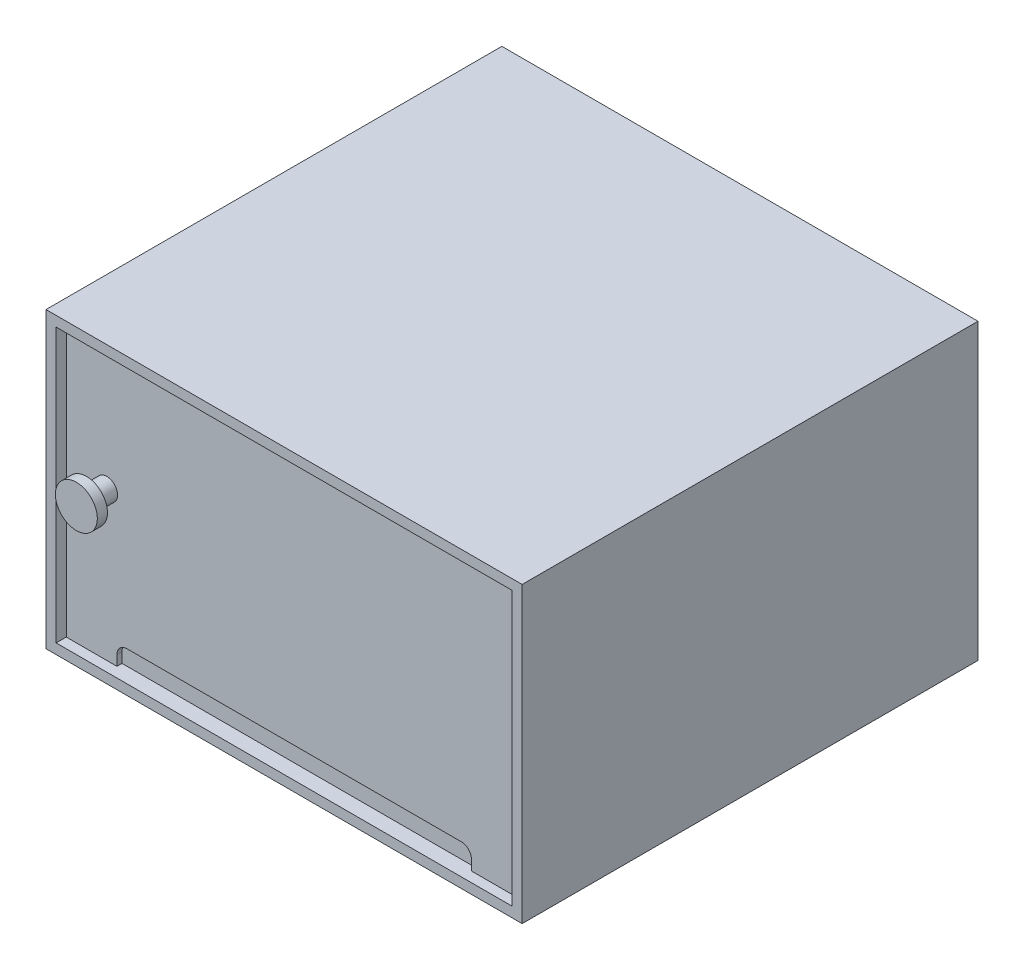
ISO-10303-21;
HEADER;
FILE_DESCRIPTION(('STEP AP214'),'2;1');
FILE_NAME('part.step','',(''),(''),'','','');
FILE_SCHEMA(('AUTOMOTIVE_DESIGN { 1 0 10303 214 1 1 1 1 }'));
ENDSEC;
DATA;
#1=APPLICATION_CONTEXT('core data for automotive mechanical design processes');
#2=APPLICATION_PROTOCOL_DEFINITION('international standard','automotive_design',2000,#1);
#3=PRODUCT_CONTEXT('',#1,'mechanical');
#4=PRODUCT('Part','Part','',(#3));
#5=PRODUCT_RELATED_PRODUCT_CATEGORY('part','',(#4));
#6=PRODUCT_DEFINITION_FORMATION('','',#4);
#7=PRODUCT_DEFINITION_CONTEXT('part definition',#1,'design');
#8=PRODUCT_DEFINITION('design','',#6,#7);
#9=PRODUCT_DEFINITION_SHAPE('','',#8);
#10=(LENGTH_UNIT() NAMED_UNIT(*) SI_UNIT(.MILLI.,.METRE.));
#11=(NAMED_UNIT(*) PLANE_ANGLE_UNIT() SI_UNIT($,.RADIAN.));
#12=(NAMED_UNIT(*) SI_UNIT($,.STERADIAN.) SOLID_ANGLE_UNIT());
#13=UNCERTAINTY_MEASURE_WITH_UNIT(LENGTH_MEASURE(1.E-05),#10,'distance_accuracy_value','');
#14=(GEOMETRIC_REPRESENTATION_CONTEXT(3) GLOBAL_UNCERTAINTY_ASSIGNED_CONTEXT((#13)) GLOBAL_UNIT_ASSIGNED_CONTEXT((#10,
#11,#12)) REPRESENTATION_CONTEXT('',''));
#15=CARTESIAN_POINT('',(0.,0.,0.));
#16=DIRECTION('',(0.,0.,1.));
#17=DIRECTION('',(1.,0.,0.));
#18=AXIS2_PLACEMENT_3D('',#15,#16,#17);
#19=CARTESIAN_POINT('',(-185.027804201985,156.673678498549,245.));
#20=DIRECTION('',(0.,0.,-1.));
#21=DIRECTION('',(-1.,0.,0.));
#22=AXIS2_PLACEMENT_3D('',#19,#20,#21);
#23=CYLINDRICAL_SURFACE('',#22,20.687155437454);
#24=CARTESIAN_POINT('',(-185.027804201985,156.673678498549,245.));
#25=DIRECTION('',(0.,0.,1.));
#26=DIRECTION('',(1.,0.,0.));
#27=AXIS2_PLACEMENT_3D('',#24,#25,#26);
#28=CIRCLE('',#27,20.687155437454);
#29=CARTESIAN_POINT('',(-164.340648764531,156.673678498549,245.));
#30=VERTEX_POINT('',#29);
#31=EDGE_CURVE('E11',#30,#30,#28,.T.);
#32=ORIENTED_EDGE('',*,*,#31,.F.);
#33=EDGE_LOOP('',(#32));
#34=FACE_BOUND('',#33,.T.);
#35=CARTESIAN_POINT('',(-185.027804201985,156.673678498549,235.));
#36=DIRECTION('',(0.,0.,1.));
#37=DIRECTION('',(1.,0.,0.));
#38=AXIS2_PLACEMENT_3D('',#35,#36,#37);
#39=CIRCLE('',#38,20.687155437454);
#40=CARTESIAN_POINT('',(-164.340648764531,156.673678498549,235.));
#41=VERTEX_POINT('',#40);
#42=EDGE_CURVE('E45',#41,#41,#39,.T.);
#43=ORIENTED_EDGE('',*,*,#42,.T.);
#44=EDGE_LOOP('',(#43));
#45=FACE_BOUND('',#44,.T.);
#46=ADVANCED_FACE('F42',(#34,#45),#23,.T.);
#47=CARTESIAN_POINT('',(-185.027804201985,156.673678498549,245.));
#48=DIRECTION('',(0.,0.,1.));
#49=DIRECTION('',(1.,0.,0.));
#50=AXIS2_PLACEMENT_3D('',#47,#48,#49);
#51=PLANE('',#50);
#52=ORIENTED_EDGE('',*,*,#31,.T.);
#53=EDGE_LOOP('',(#52));
#54=FACE_BOUND('',#53,.T.);
#55=ADVANCED_FACE('F57',(#54),#51,.T.);
#56=CARTESIAN_POINT('',(-185.027804201985,156.673678498549,235.));
#57=DIRECTION('',(0.,0.,1.));
#58=DIRECTION('',(1.,0.,0.));
#59=AXIS2_PLACEMENT_3D('',#56,#57,#58);
#60=PLANE('',#59);
#61=ORIENTED_EDGE('',*,*,#42,.F.);
#62=EDGE_LOOP('',(#61));
#63=FACE_BOUND('',#62,.T.);
#64=ADVANCED_FACE('F55',(#63),#60,.F.);
#65=CLOSED_SHELL('',(#46,#55,#64));
#66=MANIFOLD_SOLID_BREP('B2',#65);
#67=CARTESIAN_POINT('',(0.,0.,215.));
#68=DIRECTION('',(0.,0.,1.));
#69=DIRECTION('',(1.,0.,0.));
#70=AXIS2_PLACEMENT_3D('',#67,#68,#69);
#71=PLANE('',#70);
#72=DIRECTION('',(0.,-1.,0.));
#73=VECTOR('',#72,1.);
#74=CARTESIAN_POINT('',(-175.,9.99999999999996,215.));
#75=LINE('',#74,#73);
#76=CARTESIAN_POINT('',(-175.,20.,215.));
#77=VERTEX_POINT('',#76);
#78=CARTESIAN_POINT('',(-175.,9.99999999999996,215.));
#79=VERTEX_POINT('',#78);
#80=EDGE_CURVE('E220',#77,#79,#75,.T.);
#81=ORIENTED_EDGE('',*,*,#80,.F.);
#82=CARTESIAN_POINT('',(-165.,20.,215.));
#83=DIRECTION('',(0.,0.,1.));
#84=DIRECTION('',(1.,0.,0.));
#85=AXIS2_PLACEMENT_3D('',#82,#83,#84);
#86=CIRCLE('',#85,10.);
#87=CARTESIAN_POINT('',(-165.,30.,215.));
#88=VERTEX_POINT('',#87);
#89=EDGE_CURVE('E40',#77,#88,#86,.F.);
#90=ORIENTED_EDGE('',*,*,#89,.T.);
#91=DIRECTION('',(-1.,0.,0.));
#92=VECTOR('',#91,1.);
#93=CARTESIAN_POINT('',(175.,30.,215.));
#94=LINE('',#93,#92);
#95=CARTESIAN_POINT('',(165.,30.,215.));
#96=VERTEX_POINT('',#95);
#97=EDGE_CURVE('E214',#96,#88,#94,.T.);
#98=ORIENTED_EDGE('',*,*,#97,.F.);
#99=CARTESIAN_POINT('',(165.,20.,215.));
#100=DIRECTION('',(0.,0.,1.));
#101=DIRECTION('',(1.,0.,0.));
#102=AXIS2_PLACEMENT_3D('',#99,#100,#101);
#103=CIRCLE('',#102,10.);
#104=CARTESIAN_POINT('',(175.,20.,215.));
#105=VERTEX_POINT('',#104);
#106=EDGE_CURVE('E92',#96,#105,#103,.F.);
#107=ORIENTED_EDGE('',*,*,#106,.T.);
#108=DIRECTION('',(0.,1.,0.));
#109=VECTOR('',#108,1.);
#110=CARTESIAN_POINT('',(175.,10.,215.));
#111=LINE('',#110,#109);
#112=CARTESIAN_POINT('',(175.,10.,215.));
#113=VERTEX_POINT('',#112);
#114=EDGE_CURVE('E239',#113,#105,#111,.T.);
#115=ORIENTED_EDGE('',*,*,#114,.F.);
#116=DIRECTION('',(1.,0.,0.));
#117=VECTOR('',#116,1.);
#118=CARTESIAN_POINT('',(-225.,10.,215.));
#119=LINE('',#118,#117);
#120=CARTESIAN_POINT('',(225.,10.,215.));
#121=VERTEX_POINT('',#120);
#122=EDGE_CURVE('E354',#113,#121,#119,.T.);
#123=ORIENTED_EDGE('',*,*,#122,.T.);
#124=DIRECTION('',(0.,1.,0.));
#125=VECTOR('',#124,1.);
#126=CARTESIAN_POINT('',(225.,280.,215.));
#127=LINE('',#126,#125);
#128=CARTESIAN_POINT('',(225.,280.,215.));
#129=VERTEX_POINT('',#128);
#130=EDGE_CURVE('E353',#121,#129,#127,.T.);
#131=ORIENTED_EDGE('',*,*,#130,.T.);
#132=DIRECTION('',(-1.,0.,0.));
#133=VECTOR('',#132,1.);
#134=CARTESIAN_POINT('',(-225.,280.,215.));
#135=LINE('',#134,#133);
#136=CARTESIAN_POINT('',(-225.,280.,215.));
#137=VERTEX_POINT('',#136);
#138=EDGE_CURVE('E277',#129,#137,#135,.T.);
#139=ORIENTED_EDGE('',*,*,#138,.T.);
#140=DIRECTION('',(0.,-1.,0.));
#141=VECTOR('',#140,1.);
#142=CARTESIAN_POINT('',(-225.,280.,215.));
#143=LINE('',#142,#141);
#144=CARTESIAN_POINT('',(-225.,10.,215.));
#145=VERTEX_POINT('',#144);
#146=EDGE_CURVE('E285',#137,#145,#143,.T.);
#147=ORIENTED_EDGE('',*,*,#146,.T.);
#148=EDGE_CURVE('E350',#145,#79,#119,.T.);
#149=ORIENTED_EDGE('',*,*,#148,.T.);
#150=EDGE_LOOP('',(#81,#90,#98,#107,#115,#123,#131,#139,#147,#149));
#151=FACE_BOUND('',#150,.T.);
#152=CARTESIAN_POINT('',(-185.027804201985,156.673678498549,215.));
#153=DIRECTION('',(0.,0.,1.));
#154=DIRECTION('',(1.,0.,0.));
#155=AXIS2_PLACEMENT_3D('',#152,#153,#154);
#156=CIRCLE('',#155,10.687155437454);
#157=CARTESIAN_POINT('',(-174.340648764531,156.673678498549,215.));
#158=VERTEX_POINT('',#157);
#159=EDGE_CURVE('E486',#158,#158,#156,.T.);
#160=ORIENTED_EDGE('',*,*,#159,.F.);
#161=EDGE_LOOP('',(#160));
#162=FACE_BOUND('',#161,.T.);
#163=ADVANCED_FACE('F83',(#151,#162),#71,.T.);
#164=CARTESIAN_POINT('',(235.,290.,225.));
#165=DIRECTION('',(0.,0.,-1.));
#166=DIRECTION('',(-1.,0.,0.));
#167=AXIS2_PLACEMENT_3D('',#164,#165,#166);
#168=PLANE('',#167);
#169=DIRECTION('',(1.,0.,0.));
#170=VECTOR('',#169,1.);
#171=CARTESIAN_POINT('',(235.,0.,225.));
#172=LINE('',#171,#170);
#173=CARTESIAN_POINT('',(-235.,0.,225.));
#174=VERTEX_POINT('',#173);
#175=CARTESIAN_POINT('',(235.,0.,225.));
#176=VERTEX_POINT('',#175);
#177=EDGE_CURVE('E335',#174,#176,#172,.T.);
#178=ORIENTED_EDGE('',*,*,#177,.T.);
#179=DIRECTION('',(0.,-1.,0.));
#180=VECTOR('',#179,1.);
#181=CARTESIAN_POINT('',(235.,290.,225.));
#182=LINE('',#181,#180);
#183=CARTESIAN_POINT('',(235.,290.,225.));
#184=VERTEX_POINT('',#183);
#185=EDGE_CURVE('E345',#184,#176,#182,.T.);
#186=ORIENTED_EDGE('',*,*,#185,.F.);
#187=DIRECTION('',(1.,0.,0.));
#188=VECTOR('',#187,1.);
#189=CARTESIAN_POINT('',(235.,290.,225.));
#190=LINE('',#189,#188);
#191=CARTESIAN_POINT('',(-235.,290.,225.));
#192=VERTEX_POINT('',#191);
#193=EDGE_CURVE('E325',#192,#184,#190,.T.);
#194=ORIENTED_EDGE('',*,*,#193,.F.);
#195=DIRECTION('',(0.,-1.,0.));
#196=VECTOR('',#195,1.);
#197=CARTESIAN_POINT('',(-235.,290.,225.));
#198=LINE('',#197,#196);
#199=EDGE_CURVE('E248',#192,#174,#198,.T.);
#200=ORIENTED_EDGE('',*,*,#199,.T.);
#201=EDGE_LOOP('',(#178,#186,#194,#200));
#202=FACE_BOUND('',#201,.T.);
#203=DIRECTION('',(1.,0.,0.));
#204=VECTOR('',#203,1.);
#205=CARTESIAN_POINT('',(235.,10.,225.));
#206=LINE('',#205,#204);
#207=CARTESIAN_POINT('',(-225.,10.,225.));
#208=VERTEX_POINT('',#207);
#209=CARTESIAN_POINT('',(225.,10.,225.));
#210=VERTEX_POINT('',#209);
#211=EDGE_CURVE('E288',#208,#210,#206,.T.);
#212=ORIENTED_EDGE('',*,*,#211,.F.);
#213=DIRECTION('',(0.,-1.,0.));
#214=VECTOR('',#213,1.);
#215=CARTESIAN_POINT('',(-225.,290.,225.));
#216=LINE('',#215,#214);
#217=CARTESIAN_POINT('',(-225.,280.,225.));
#218=VERTEX_POINT('',#217);
#219=EDGE_CURVE('E313',#218,#208,#216,.T.);
#220=ORIENTED_EDGE('',*,*,#219,.F.);
#221=DIRECTION('',(1.,0.,0.));
#222=VECTOR('',#221,1.);
#223=CARTESIAN_POINT('',(235.,280.,225.));
#224=LINE('',#223,#222);
#225=CARTESIAN_POINT('',(225.,280.,225.));
#226=VERTEX_POINT('',#225);
#227=EDGE_CURVE('E292',#218,#226,#224,.T.);
#228=ORIENTED_EDGE('',*,*,#227,.T.);
#229=DIRECTION('',(0.,-1.,0.));
#230=VECTOR('',#229,1.);
#231=CARTESIAN_POINT('',(225.,290.,225.));
#232=LINE('',#231,#230);
#233=EDGE_CURVE('E306',#226,#210,#232,.T.);
#234=ORIENTED_EDGE('',*,*,#233,.T.);
#235=EDGE_LOOP('',(#212,#220,#228,#234));
#236=FACE_BOUND('',#235,.T.);
#237=ADVANCED_FACE('F371',(#202,#236),#168,.F.);
#238=CARTESIAN_POINT('',(-235.,290.,225.));
#239=DIRECTION('',(1.,0.,0.));
#240=DIRECTION('',(0.,0.,-1.));
#241=AXIS2_PLACEMENT_3D('',#238,#239,#240);
#242=PLANE('',#241);
#243=DIRECTION('',(0.,0.,1.));
#244=VECTOR('',#243,1.);
#245=CARTESIAN_POINT('',(-235.,0.,225.));
#246=LINE('',#245,#244);
#247=CARTESIAN_POINT('',(-235.,0.,-225.));
#248=VERTEX_POINT('',#247);
#249=EDGE_CURVE('E316',#248,#174,#246,.T.);
#250=ORIENTED_EDGE('',*,*,#249,.T.);
#251=ORIENTED_EDGE('',*,*,#199,.F.);
#252=DIRECTION('',(0.,0.,1.));
#253=VECTOR('',#252,1.);
#254=CARTESIAN_POINT('',(-235.,290.,225.));
#255=LINE('',#254,#253);
#256=CARTESIAN_POINT('',(-235.,290.,-225.));
#257=VERTEX_POINT('',#256);
#258=EDGE_CURVE('E322',#257,#192,#255,.T.);
#259=ORIENTED_EDGE('',*,*,#258,.F.);
#260=DIRECTION('',(0.,-1.,0.));
#261=VECTOR('',#260,1.);
#262=CARTESIAN_POINT('',(-235.,290.,-225.));
#263=LINE('',#262,#261);
#264=EDGE_CURVE('E332',#257,#248,#263,.T.);
#265=ORIENTED_EDGE('',*,*,#264,.T.);
#266=EDGE_LOOP('',(#250,#251,#259,#265));
#267=FACE_BOUND('',#266,.T.);
#268=ADVANCED_FACE('F398',(#267),#242,.F.);
#269=CARTESIAN_POINT('',(235.,290.,225.));
#270=DIRECTION('',(-1.,0.,0.));
#271=DIRECTION('',(0.,0.,1.));
#272=AXIS2_PLACEMENT_3D('',#269,#270,#271);
#273=PLANE('',#272);
#274=DIRECTION('',(0.,0.,-1.));
#275=VECTOR('',#274,1.);
#276=CARTESIAN_POINT('',(235.,0.,225.));
#277=LINE('',#276,#275);
#278=CARTESIAN_POINT('',(235.,0.,-225.));
#279=VERTEX_POINT('',#278);
#280=EDGE_CURVE('E337',#176,#279,#277,.T.);
#281=ORIENTED_EDGE('',*,*,#280,.T.);
#282=DIRECTION('',(0.,-1.,0.));
#283=VECTOR('',#282,1.);
#284=CARTESIAN_POINT('',(235.,290.,-225.));
#285=LINE('',#284,#283);
#286=CARTESIAN_POINT('',(235.,290.,-225.));
#287=VERTEX_POINT('',#286);
#288=EDGE_CURVE('E342',#287,#279,#285,.T.);
#289=ORIENTED_EDGE('',*,*,#288,.F.);
#290=DIRECTION('',(0.,0.,-1.));
#291=VECTOR('',#290,1.);
#292=CARTESIAN_POINT('',(235.,290.,225.));
#293=LINE('',#292,#291);
#294=EDGE_CURVE('E328',#184,#287,#293,.T.);
#295=ORIENTED_EDGE('',*,*,#294,.F.);
#296=ORIENTED_EDGE('',*,*,#185,.T.);
#297=EDGE_LOOP('',(#281,#289,#295,#296));
#298=FACE_BOUND('',#297,.T.);
#299=ADVANCED_FACE('F446',(#298),#273,.F.);
#300=CARTESIAN_POINT('',(235.,290.,-225.));
#301=DIRECTION('',(0.,0.,1.));
#302=DIRECTION('',(1.,0.,0.));
#303=AXIS2_PLACEMENT_3D('',#300,#301,#302);
#304=PLANE('',#303);
#305=DIRECTION('',(-1.,0.,0.));
#306=VECTOR('',#305,1.);
#307=CARTESIAN_POINT('',(235.,0.,-225.));
#308=LINE('',#307,#306);
#309=EDGE_CURVE('E326',#279,#248,#308,.T.);
#310=ORIENTED_EDGE('',*,*,#309,.T.);
#311=ORIENTED_EDGE('',*,*,#264,.F.);
#312=DIRECTION('',(-1.,0.,0.));
#313=VECTOR('',#312,1.);
#314=CARTESIAN_POINT('',(235.,290.,-225.));
#315=LINE('',#314,#313);
#316=EDGE_CURVE('E330',#287,#257,#315,.T.);
#317=ORIENTED_EDGE('',*,*,#316,.F.);
#318=ORIENTED_EDGE('',*,*,#288,.T.);
#319=EDGE_LOOP('',(#310,#311,#317,#318));
#320=FACE_BOUND('',#319,.T.);
#321=ADVANCED_FACE('F439',(#320),#304,.F.);
#322=CARTESIAN_POINT('',(0.,290.,0.));
#323=DIRECTION('',(0.,1.,0.));
#324=DIRECTION('',(0.,0.,1.));
#325=AXIS2_PLACEMENT_3D('',#322,#323,#324);
#326=PLANE('',#325);
#327=ORIENTED_EDGE('',*,*,#258,.T.);
#328=ORIENTED_EDGE('',*,*,#193,.T.);
#329=ORIENTED_EDGE('',*,*,#294,.T.);
#330=ORIENTED_EDGE('',*,*,#316,.T.);
#331=EDGE_LOOP('',(#327,#328,#329,#330));
#332=FACE_BOUND('',#331,.T.);
#333=ADVANCED_FACE('F436',(#332),#326,.T.);
#334=CARTESIAN_POINT('',(0.,0.,0.));
#335=DIRECTION('',(0.,1.,0.));
#336=DIRECTION('',(0.,0.,1.));
#337=AXIS2_PLACEMENT_3D('',#334,#335,#336);
#338=PLANE('',#337);
#339=ORIENTED_EDGE('',*,*,#249,.F.);
#340=ORIENTED_EDGE('',*,*,#309,.F.);
#341=ORIENTED_EDGE('',*,*,#280,.F.);
#342=ORIENTED_EDGE('',*,*,#177,.F.);
#343=EDGE_LOOP('',(#339,#340,#341,#342));
#344=FACE_BOUND('',#343,.T.);
#345=ADVANCED_FACE('F411',(#344),#338,.F.);
#346=CARTESIAN_POINT('',(-225.,290.,225.));
#347=DIRECTION('',(1.,0.,0.));
#348=DIRECTION('',(0.,0.,-1.));
#349=AXIS2_PLACEMENT_3D('',#346,#347,#348);
#350=PLANE('',#349);
#351=ORIENTED_EDGE('',*,*,#146,.F.);
#352=DIRECTION('',(0.,0.,1.));
#353=VECTOR('',#352,1.);
#354=CARTESIAN_POINT('',(-225.,280.,225.));
#355=LINE('',#354,#353);
#356=EDGE_CURVE('E293',#137,#218,#355,.T.);
#357=ORIENTED_EDGE('',*,*,#356,.T.);
#358=ORIENTED_EDGE('',*,*,#219,.T.);
#359=DIRECTION('',(0.,0.,1.));
#360=VECTOR('',#359,1.);
#361=CARTESIAN_POINT('',(-225.,10.,225.));
#362=LINE('',#361,#360);
#363=EDGE_CURVE('E289',#145,#208,#362,.T.);
#364=ORIENTED_EDGE('',*,*,#363,.F.);
#365=EDGE_LOOP('',(#351,#357,#358,#364));
#366=FACE_BOUND('',#365,.T.);
#367=ADVANCED_FACE('F367',(#366),#350,.T.);
#368=CARTESIAN_POINT('',(225.,290.,225.));
#369=DIRECTION('',(-1.,0.,0.));
#370=DIRECTION('',(0.,0.,1.));
#371=AXIS2_PLACEMENT_3D('',#368,#369,#370);
#372=PLANE('',#371);
#373=ORIENTED_EDGE('',*,*,#130,.F.);
#374=DIRECTION('',(0.,0.,-1.));
#375=VECTOR('',#374,1.);
#376=CARTESIAN_POINT('',(225.,10.,225.));
#377=LINE('',#376,#375);
#378=EDGE_CURVE('E301',#210,#121,#377,.T.);
#379=ORIENTED_EDGE('',*,*,#378,.F.);
#380=ORIENTED_EDGE('',*,*,#233,.F.);
#381=DIRECTION('',(0.,0.,-1.));
#382=VECTOR('',#381,1.);
#383=CARTESIAN_POINT('',(225.,280.,225.));
#384=LINE('',#383,#382);
#385=EDGE_CURVE('E303',#226,#129,#384,.T.);
#386=ORIENTED_EDGE('',*,*,#385,.T.);
#387=EDGE_LOOP('',(#373,#379,#380,#386));
#388=FACE_BOUND('',#387,.T.);
#389=ADVANCED_FACE('F374',(#388),#372,.T.);
#390=CARTESIAN_POINT('',(0.,280.,0.));
#391=DIRECTION('',(0.,1.,0.));
#392=DIRECTION('',(0.,0.,1.));
#393=AXIS2_PLACEMENT_3D('',#390,#391,#392);
#394=PLANE('',#393);
#395=ORIENTED_EDGE('',*,*,#356,.F.);
#396=ORIENTED_EDGE('',*,*,#138,.F.);
#397=ORIENTED_EDGE('',*,*,#385,.F.);
#398=ORIENTED_EDGE('',*,*,#227,.F.);
#399=EDGE_LOOP('',(#395,#396,#397,#398));
#400=FACE_BOUND('',#399,.T.);
#401=ADVANCED_FACE('F376',(#400),#394,.F.);
#402=CARTESIAN_POINT('',(0.,10.,0.));
#403=DIRECTION('',(0.,1.,0.));
#404=DIRECTION('',(0.,0.,1.));
#405=AXIS2_PLACEMENT_3D('',#402,#403,#404);
#406=PLANE('',#405);
#407=ORIENTED_EDGE('',*,*,#148,.F.);
#408=ORIENTED_EDGE('',*,*,#363,.T.);
#409=ORIENTED_EDGE('',*,*,#211,.T.);
#410=ORIENTED_EDGE('',*,*,#378,.T.);
#411=ORIENTED_EDGE('',*,*,#122,.F.);
#412=DIRECTION('',(0.,0.,1.));
#413=VECTOR('',#412,1.);
#414=CARTESIAN_POINT('',(175.,10.,210.));
#415=LINE('',#414,#413);
#416=CARTESIAN_POINT('',(175.,10.,210.));
#417=VERTEX_POINT('',#416);
#418=EDGE_CURVE('E223',#417,#113,#415,.T.);
#419=ORIENTED_EDGE('',*,*,#418,.F.);
#420=DIRECTION('',(1.,0.,0.));
#421=VECTOR('',#420,1.);
#422=CARTESIAN_POINT('',(175.,10.,210.));
#423=LINE('',#422,#421);
#424=CARTESIAN_POINT('',(-175.,9.99999999999996,210.));
#425=VERTEX_POINT('',#424);
#426=EDGE_CURVE('E212',#425,#417,#423,.T.);
#427=ORIENTED_EDGE('',*,*,#426,.F.);
#428=DIRECTION('',(0.,0.,1.));
#429=VECTOR('',#428,1.);
#430=CARTESIAN_POINT('',(-175.,9.99999999999996,210.));
#431=LINE('',#430,#429);
#432=EDGE_CURVE('E217',#425,#79,#431,.T.);
#433=ORIENTED_EDGE('',*,*,#432,.T.);
#434=EDGE_LOOP('',(#407,#408,#409,#410,#411,#419,#427,#433));
#435=FACE_BOUND('',#434,.T.);
#436=ADVANCED_FACE('F226',(#435),#406,.T.);
#437=CARTESIAN_POINT('',(-175.,9.99999999999996,210.));
#438=DIRECTION('',(-1.,0.,0.));
#439=DIRECTION('',(0.,0.,1.));
#440=AXIS2_PLACEMENT_3D('',#437,#438,#439);
#441=PLANE('',#440);
#442=DIRECTION('',(0.,-1.,0.));
#443=VECTOR('',#442,1.);
#444=CARTESIAN_POINT('',(-175.,9.99999999999996,210.));
#445=LINE('',#444,#443);
#446=CARTESIAN_POINT('',(-175.,20.,210.));
#447=VERTEX_POINT('',#446);
#448=EDGE_CURVE('E207',#447,#425,#445,.T.);
#449=ORIENTED_EDGE('',*,*,#448,.F.);
#450=DIRECTION('',(0.,0.,1.));
#451=VECTOR('',#450,1.);
#452=CARTESIAN_POINT('',(-175.,20.,215.));
#453=LINE('',#452,#451);
#454=EDGE_CURVE('E256',#447,#77,#453,.T.);
#455=ORIENTED_EDGE('',*,*,#454,.T.);
#456=ORIENTED_EDGE('',*,*,#80,.T.);
#457=ORIENTED_EDGE('',*,*,#432,.F.);
#458=EDGE_LOOP('',(#449,#455,#456,#457));
#459=FACE_BOUND('',#458,.T.);
#460=ADVANCED_FACE('F218',(#459),#441,.F.);
#461=CARTESIAN_POINT('',(175.,30.,210.));
#462=DIRECTION('',(0.,1.,0.));
#463=DIRECTION('',(-1.,0.,0.));
#464=AXIS2_PLACEMENT_3D('',#461,#462,#463);
#465=PLANE('',#464);
#466=DIRECTION('',(-1.,0.,0.));
#467=VECTOR('',#466,1.);
#468=CARTESIAN_POINT('',(175.,30.,210.));
#469=LINE('',#468,#467);
#470=CARTESIAN_POINT('',(165.,30.,210.));
#471=VERTEX_POINT('',#470);
#472=CARTESIAN_POINT('',(-165.,30.,210.));
#473=VERTEX_POINT('',#472);
#474=EDGE_CURVE('E224',#471,#473,#469,.T.);
#475=ORIENTED_EDGE('',*,*,#474,.F.);
#476=DIRECTION('',(0.,0.,1.));
#477=VECTOR('',#476,1.);
#478=CARTESIAN_POINT('',(165.,30.,215.));
#479=LINE('',#478,#477);
#480=EDGE_CURVE('E247',#471,#96,#479,.T.);
#481=ORIENTED_EDGE('',*,*,#480,.T.);
#482=ORIENTED_EDGE('',*,*,#97,.T.);
#483=DIRECTION('',(0.,0.,1.));
#484=VECTOR('',#483,1.);
#485=CARTESIAN_POINT('',(-165.,30.,210.));
#486=LINE('',#485,#484);
#487=EDGE_CURVE('E245',#88,#473,#486,.F.);
#488=ORIENTED_EDGE('',*,*,#487,.T.);
#489=EDGE_LOOP('',(#475,#481,#482,#488));
#490=FACE_BOUND('',#489,.T.);
#491=ADVANCED_FACE('F468',(#490),#465,.F.);
#492=CARTESIAN_POINT('',(175.,10.,210.));
#493=DIRECTION('',(1.,0.,0.));
#494=DIRECTION('',(0.,0.,-1.));
#495=AXIS2_PLACEMENT_3D('',#492,#493,#494);
#496=PLANE('',#495);
#497=ORIENTED_EDGE('',*,*,#114,.T.);
#498=DIRECTION('',(0.,0.,1.));
#499=VECTOR('',#498,1.);
#500=CARTESIAN_POINT('',(175.,20.,210.));
#501=LINE('',#500,#499);
#502=CARTESIAN_POINT('',(175.,20.,210.));
#503=VERTEX_POINT('',#502);
#504=EDGE_CURVE('E251',#105,#503,#501,.F.);
#505=ORIENTED_EDGE('',*,*,#504,.T.);
#506=DIRECTION('',(0.,1.,0.));
#507=VECTOR('',#506,1.);
#508=CARTESIAN_POINT('',(175.,10.,210.));
#509=LINE('',#508,#507);
#510=EDGE_CURVE('E229',#417,#503,#509,.T.);
#511=ORIENTED_EDGE('',*,*,#510,.F.);
#512=ORIENTED_EDGE('',*,*,#418,.T.);
#513=EDGE_LOOP('',(#497,#505,#511,#512));
#514=FACE_BOUND('',#513,.T.);
#515=ADVANCED_FACE('F461',(#514),#496,.F.);
#516=CARTESIAN_POINT('',(0.,0.,210.));
#517=DIRECTION('',(0.,0.,1.));
#518=DIRECTION('',(1.,0.,0.));
#519=AXIS2_PLACEMENT_3D('',#516,#517,#518);
#520=PLANE('',#519);
#521=ORIENTED_EDGE('',*,*,#510,.T.);
#522=CARTESIAN_POINT('',(165.,20.,210.));
#523=DIRECTION('',(0.,0.,1.));
#524=DIRECTION('',(1.,0.,0.));
#525=AXIS2_PLACEMENT_3D('',#522,#523,#524);
#526=CIRCLE('',#525,10.);
#527=EDGE_CURVE('E254',#503,#471,#526,.T.);
#528=ORIENTED_EDGE('',*,*,#527,.T.);
#529=ORIENTED_EDGE('',*,*,#474,.T.);
#530=CARTESIAN_POINT('',(-165.,20.,210.));
#531=DIRECTION('',(0.,0.,1.));
#532=DIRECTION('',(1.,0.,0.));
#533=AXIS2_PLACEMENT_3D('',#530,#531,#532);
#534=CIRCLE('',#533,10.);
#535=EDGE_CURVE('E105',#473,#447,#534,.T.);
#536=ORIENTED_EDGE('',*,*,#535,.T.);
#537=ORIENTED_EDGE('',*,*,#448,.T.);
#538=ORIENTED_EDGE('',*,*,#426,.T.);
#539=EDGE_LOOP('',(#521,#528,#529,#536,#537,#538));
#540=FACE_BOUND('',#539,.T.);
#541=ADVANCED_FACE('F210',(#540),#520,.T.);
#542=CARTESIAN_POINT('',(165.,20.,210.));
#543=DIRECTION('',(0.,0.,-1.));
#544=DIRECTION('',(-1.,0.,0.));
#545=AXIS2_PLACEMENT_3D('',#542,#543,#544);
#546=CYLINDRICAL_SURFACE('',#545,10.);
#547=ORIENTED_EDGE('',*,*,#527,.F.);
#548=ORIENTED_EDGE('',*,*,#504,.F.);
#549=ORIENTED_EDGE('',*,*,#106,.F.);
#550=ORIENTED_EDGE('',*,*,#480,.F.);
#551=EDGE_LOOP('',(#547,#548,#549,#550));
#552=FACE_BOUND('',#551,.T.);
#553=ADVANCED_FACE('F453',(#552),#546,.F.);
#554=CARTESIAN_POINT('',(-165.,20.,210.));
#555=DIRECTION('',(0.,0.,-1.));
#556=DIRECTION('',(-1.,0.,0.));
#557=AXIS2_PLACEMENT_3D('',#554,#555,#556);
#558=CYLINDRICAL_SURFACE('',#557,10.);
#559=ORIENTED_EDGE('',*,*,#535,.F.);
#560=ORIENTED_EDGE('',*,*,#487,.F.);
#561=ORIENTED_EDGE('',*,*,#89,.F.);
#562=ORIENTED_EDGE('',*,*,#454,.F.);
#563=EDGE_LOOP('',(#559,#560,#561,#562));
#564=FACE_BOUND('',#563,.T.);
#565=ADVANCED_FACE('F85',(#564),#558,.F.);
#566=CARTESIAN_POINT('',(-185.027804201985,156.673678498549,235.));
#567=DIRECTION('',(0.,0.,-1.));
#568=DIRECTION('',(-1.,0.,0.));
#569=AXIS2_PLACEMENT_3D('',#566,#567,#568);
#570=CYLINDRICAL_SURFACE('',#569,10.687155437454);
#571=CARTESIAN_POINT('',(-185.027804201985,156.673678498549,235.));
#572=DIRECTION('',(0.,0.,1.));
#573=DIRECTION('',(1.,0.,0.));
#574=AXIS2_PLACEMENT_3D('',#571,#572,#573);
#575=CIRCLE('',#574,10.687155437454);
#576=CARTESIAN_POINT('',(-174.340648764531,156.673678498549,235.));
#577=VERTEX_POINT('',#576);
#578=EDGE_CURVE('E259',#577,#577,#575,.T.);
#579=ORIENTED_EDGE('',*,*,#578,.F.);
#580=EDGE_LOOP('',(#579));
#581=FACE_BOUND('',#580,.T.);
#582=ORIENTED_EDGE('',*,*,#159,.T.);
#583=EDGE_LOOP('',(#582));
#584=FACE_BOUND('',#583,.T.);
#585=ADVANCED_FACE('F460',(#581,#584),#570,.T.);
#586=CARTESIAN_POINT('',(-185.027804201985,156.673678498549,235.));
#587=DIRECTION('',(0.,0.,1.));
#588=DIRECTION('',(1.,0.,0.));
#589=AXIS2_PLACEMENT_3D('',#586,#587,#588);
#590=PLANE('',#589);
#591=ORIENTED_EDGE('',*,*,#578,.T.);
#592=EDGE_LOOP('',(#591));
#593=FACE_BOUND('',#592,.T.);
#594=ADVANCED_FACE('F479',(#593),#590,.T.);
#595=CLOSED_SHELL('',(#163,#237,#268,#299,#321,#333,#345,#367,#389,#401,#436,#460,#491,#515,
#541,#553,#565,#585,#594));
#596=CARTESIAN_POINT('',(235.,290.,-215.));
#597=DIRECTION('',(0.,0.,1.));
#598=DIRECTION('',(1.,0.,0.));
#599=AXIS2_PLACEMENT_3D('',#596,#597,#598);
#600=PLANE('',#599);
#601=DIRECTION('',(-1.,0.,0.));
#602=VECTOR('',#601,1.);
#603=CARTESIAN_POINT('',(235.,10.,-215.));
#604=LINE('',#603,#602);
#605=CARTESIAN_POINT('',(225.,10.,-215.));
#606=VERTEX_POINT('',#605);
#607=CARTESIAN_POINT('',(-225.,10.,-215.));
#608=VERTEX_POINT('',#607);
#609=EDGE_CURVE('E299',#606,#608,#604,.T.);
#610=ORIENTED_EDGE('',*,*,#609,.F.);
#611=DIRECTION('',(0.,-1.,0.));
#612=VECTOR('',#611,1.);
#613=CARTESIAN_POINT('',(225.,290.,-215.));
#614=LINE('',#613,#612);
#615=CARTESIAN_POINT('',(225.,280.,-215.));
#616=VERTEX_POINT('',#615);
#617=EDGE_CURVE('E297',#616,#606,#614,.T.);
#618=ORIENTED_EDGE('',*,*,#617,.F.);
#619=DIRECTION('',(-1.,0.,0.));
#620=VECTOR('',#619,1.);
#621=CARTESIAN_POINT('',(235.,280.,-215.));
#622=LINE('',#621,#620);
#623=CARTESIAN_POINT('',(-225.,280.,-215.));
#624=VERTEX_POINT('',#623);
#625=EDGE_CURVE('E298',#616,#624,#622,.T.);
#626=ORIENTED_EDGE('',*,*,#625,.T.);
#627=DIRECTION('',(0.,-1.,0.));
#628=VECTOR('',#627,1.);
#629=CARTESIAN_POINT('',(-225.,290.,-215.));
#630=LINE('',#629,#628);
#631=EDGE_CURVE('E294',#624,#608,#630,.T.);
#632=ORIENTED_EDGE('',*,*,#631,.T.);
#633=EDGE_LOOP('',(#610,#618,#626,#632));
#634=FACE_BOUND('',#633,.T.);
#635=ADVANCED_FACE('F390',(#634),#600,.T.);
#636=DIRECTION('',(-1.,0.,0.));
#637=VECTOR('',#636,1.);
#638=CARTESIAN_POINT('',(-225.,280.,205.));
#639=LINE('',#638,#637);
#640=CARTESIAN_POINT('',(225.,280.,205.));
#641=VERTEX_POINT('',#640);
#642=CARTESIAN_POINT('',(-225.,280.,205.));
#643=VERTEX_POINT('',#642);
#644=EDGE_CURVE('E282',#641,#643,#639,.T.);
#645=ORIENTED_EDGE('',*,*,#644,.T.);
#646=EDGE_CURVE('E290',#624,#643,#355,.T.);
#647=ORIENTED_EDGE('',*,*,#646,.F.);
#648=ORIENTED_EDGE('',*,*,#625,.F.);
#649=EDGE_CURVE('E312',#641,#616,#384,.T.);
#650=ORIENTED_EDGE('',*,*,#649,.F.);
#651=EDGE_LOOP('',(#645,#647,#648,#650));
#652=FACE_BOUND('',#651,.T.);
#653=ADVANCED_FACE('F379',(#652),#394,.F.);
#654=CARTESIAN_POINT('',(-225.,10.,205.));
#655=VERTEX_POINT('',#654);
#656=EDGE_CURVE('E286',#608,#655,#362,.T.);
#657=ORIENTED_EDGE('',*,*,#656,.T.);
#658=DIRECTION('',(1.,0.,0.));
#659=VECTOR('',#658,1.);
#660=CARTESIAN_POINT('',(-225.,10.,205.));
#661=LINE('',#660,#659);
#662=CARTESIAN_POINT('',(225.,10.,205.));
#663=VERTEX_POINT('',#662);
#664=EDGE_CURVE('E267',#655,#663,#661,.T.);
#665=ORIENTED_EDGE('',*,*,#664,.T.);
#666=EDGE_CURVE('E309',#663,#606,#377,.T.);
#667=ORIENTED_EDGE('',*,*,#666,.T.);
#668=ORIENTED_EDGE('',*,*,#609,.T.);
#669=EDGE_LOOP('',(#657,#665,#667,#668));
#670=FACE_BOUND('',#669,.T.);
#671=ADVANCED_FACE('F385',(#670),#406,.T.);
#672=ORIENTED_EDGE('',*,*,#666,.F.);
#673=DIRECTION('',(0.,1.,0.));
#674=VECTOR('',#673,1.);
#675=CARTESIAN_POINT('',(225.,280.,205.));
#676=LINE('',#675,#674);
#677=EDGE_CURVE('E274',#663,#641,#676,.T.);
#678=ORIENTED_EDGE('',*,*,#677,.T.);
#679=ORIENTED_EDGE('',*,*,#649,.T.);
#680=ORIENTED_EDGE('',*,*,#617,.T.);
#681=EDGE_LOOP('',(#672,#678,#679,#680));
#682=FACE_BOUND('',#681,.T.);
#683=ADVANCED_FACE('F387',(#682),#372,.T.);
#684=ORIENTED_EDGE('',*,*,#646,.T.);
#685=DIRECTION('',(0.,-1.,0.));
#686=VECTOR('',#685,1.);
#687=CARTESIAN_POINT('',(-225.,280.,205.));
#688=LINE('',#687,#686);
#689=EDGE_CURVE('E263',#643,#655,#688,.T.);
#690=ORIENTED_EDGE('',*,*,#689,.T.);
#691=ORIENTED_EDGE('',*,*,#656,.F.);
#692=ORIENTED_EDGE('',*,*,#631,.F.);
#693=EDGE_LOOP('',(#684,#690,#691,#692));
#694=FACE_BOUND('',#693,.T.);
#695=ADVANCED_FACE('F408',(#694),#350,.T.);
#696=CARTESIAN_POINT('',(0.,0.,205.));
#697=DIRECTION('',(0.,0.,1.));
#698=DIRECTION('',(1.,0.,0.));
#699=AXIS2_PLACEMENT_3D('',#696,#697,#698);
#700=PLANE('',#699);
#701=ORIENTED_EDGE('',*,*,#689,.F.);
#702=ORIENTED_EDGE('',*,*,#644,.F.);
#703=ORIENTED_EDGE('',*,*,#677,.F.);
#704=ORIENTED_EDGE('',*,*,#664,.F.);
#705=EDGE_LOOP('',(#701,#702,#703,#704));
#706=FACE_BOUND('',#705,.T.);
#707=ADVANCED_FACE('F405',(#706),#700,.F.);
#708=CLOSED_SHELL('',(#635,#653,#671,#683,#695,#707));
#709=ORIENTED_CLOSED_SHELL('',*,#708,.T.);
#710=BREP_WITH_VOIDS('B6',#595,(#709));
#711=ADVANCED_BREP_SHAPE_REPRESENTATION('',(#18,#66,#710),#14);
#712=SHAPE_DEFINITION_REPRESENTATION(#9,#711);
ENDSEC;
END-ISO-10303-21;
